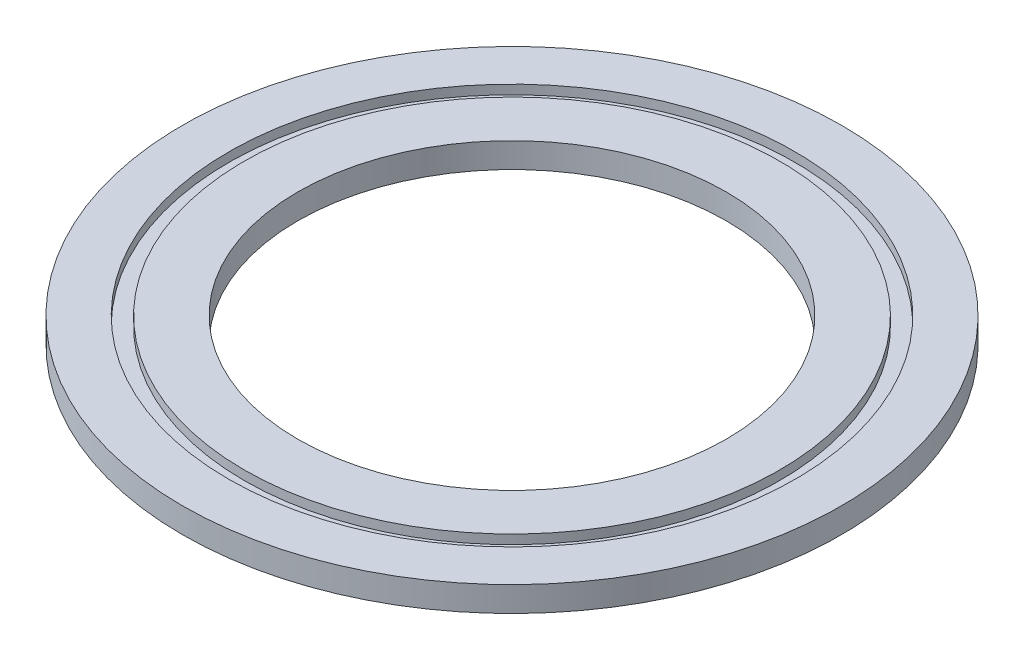
ISO-10303-21;
HEADER;
FILE_DESCRIPTION(('STEP AP214'),'2;1');
FILE_NAME('part.step','',(''),(''),'','','');
FILE_SCHEMA(('AUTOMOTIVE_DESIGN { 1 0 10303 214 1 1 1 1 }'));
ENDSEC;
DATA;
#1=APPLICATION_CONTEXT('core data for automotive mechanical design processes');
#2=APPLICATION_PROTOCOL_DEFINITION('international standard','automotive_design',2000,#1);
#3=PRODUCT_CONTEXT('',#1,'mechanical');
#4=PRODUCT('Part','Part','',(#3));
#5=PRODUCT_RELATED_PRODUCT_CATEGORY('part','',(#4));
#6=PRODUCT_DEFINITION_FORMATION('','',#4);
#7=PRODUCT_DEFINITION_CONTEXT('part definition',#1,'design');
#8=PRODUCT_DEFINITION('design','',#6,#7);
#9=PRODUCT_DEFINITION_SHAPE('','',#8);
#10=(LENGTH_UNIT() NAMED_UNIT(*) SI_UNIT(.MILLI.,.METRE.));
#11=(NAMED_UNIT(*) PLANE_ANGLE_UNIT() SI_UNIT($,.RADIAN.));
#12=(NAMED_UNIT(*) SI_UNIT($,.STERADIAN.) SOLID_ANGLE_UNIT());
#13=UNCERTAINTY_MEASURE_WITH_UNIT(LENGTH_MEASURE(1.E-05),#10,'distance_accuracy_value','');
#14=(GEOMETRIC_REPRESENTATION_CONTEXT(3) GLOBAL_UNCERTAINTY_ASSIGNED_CONTEXT((#13)) GLOBAL_UNIT_ASSIGNED_CONTEXT((#10,
#11,#12)) REPRESENTATION_CONTEXT('',''));
#15=CARTESIAN_POINT('',(0.,0.,0.));
#16=DIRECTION('',(0.,0.,1.));
#17=DIRECTION('',(1.,0.,0.));
#18=AXIS2_PLACEMENT_3D('',#15,#16,#17);
#19=CARTESIAN_POINT('',(0.,19.,0.));
#20=DIRECTION('',(0.,1.,0.));
#21=DIRECTION('',(0.,0.,1.));
#22=AXIS2_PLACEMENT_3D('',#19,#20,#21);
#23=PLANE('',#22);
#24=CARTESIAN_POINT('',(0.,19.,0.));
#25=DIRECTION('',(0.,1.,0.));
#26=DIRECTION('',(0.,0.,1.));
#27=AXIS2_PLACEMENT_3D('',#24,#25,#26);
#28=CIRCLE('',#27,162.5);
#29=CARTESIAN_POINT('',(0.,19.,162.5));
#30=VERTEX_POINT('',#29);
#31=EDGE_CURVE('E47',#30,#30,#28,.T.);
#32=ORIENTED_EDGE('',*,*,#31,.F.);
#33=EDGE_LOOP('',(#32));
#34=FACE_BOUND('',#33,.T.);
#35=CARTESIAN_POINT('',(0.,19.,0.));
#36=DIRECTION('',(0.,1.,0.));
#37=DIRECTION('',(0.,0.,1.));
#38=AXIS2_PLACEMENT_3D('',#35,#36,#37);
#39=CIRCLE('',#38,203.);
#40=CARTESIAN_POINT('',(0.,19.,203.));
#41=VERTEX_POINT('',#40);
#42=EDGE_CURVE('E61',#41,#41,#39,.T.);
#43=ORIENTED_EDGE('',*,*,#42,.T.);
#44=EDGE_LOOP('',(#43));
#45=FACE_BOUND('',#44,.T.);
#46=ADVANCED_FACE('F36',(#34,#45),#23,.T.);
#47=CARTESIAN_POINT('',(0.,19.,0.));
#48=DIRECTION('',(0.,1.,0.));
#49=DIRECTION('',(0.,0.,1.));
#50=AXIS2_PLACEMENT_3D('',#47,#48,#49);
#51=CIRCLE('',#50,215.);
#52=CARTESIAN_POINT('',(0.,19.,215.));
#53=VERTEX_POINT('',#52);
#54=EDGE_CURVE('E55',#53,#53,#51,.T.);
#55=ORIENTED_EDGE('',*,*,#54,.F.);
#56=EDGE_LOOP('',(#55));
#57=FACE_BOUND('',#56,.T.);
#58=CARTESIAN_POINT('',(0.,19.,0.));
#59=DIRECTION('',(0.,1.,0.));
#60=DIRECTION('',(0.,0.,1.));
#61=AXIS2_PLACEMENT_3D('',#58,#59,#60);
#62=CIRCLE('',#61,250.);
#63=CARTESIAN_POINT('',(0.,19.,250.));
#64=VERTEX_POINT('',#63);
#65=EDGE_CURVE('E10',#64,#64,#62,.T.);
#66=ORIENTED_EDGE('',*,*,#65,.T.);
#67=EDGE_LOOP('',(#66));
#68=FACE_BOUND('',#67,.T.);
#69=ADVANCED_FACE('F83',(#57,#68),#23,.T.);
#70=CARTESIAN_POINT('',(0.,0.,0.));
#71=DIRECTION('',(0.,1.,0.));
#72=DIRECTION('',(0.,0.,1.));
#73=AXIS2_PLACEMENT_3D('',#70,#71,#72);
#74=PLANE('',#73);
#75=CARTESIAN_POINT('',(0.,0.,0.));
#76=DIRECTION('',(0.,1.,0.));
#77=DIRECTION('',(0.,0.,1.));
#78=AXIS2_PLACEMENT_3D('',#75,#76,#77);
#79=CIRCLE('',#78,250.);
#80=CARTESIAN_POINT('',(0.,0.,250.));
#81=VERTEX_POINT('',#80);
#82=EDGE_CURVE('E40',#81,#81,#79,.T.);
#83=ORIENTED_EDGE('',*,*,#82,.F.);
#84=EDGE_LOOP('',(#83));
#85=FACE_BOUND('',#84,.T.);
#86=CARTESIAN_POINT('',(0.,0.,0.));
#87=DIRECTION('',(0.,1.,0.));
#88=DIRECTION('',(0.,0.,1.));
#89=AXIS2_PLACEMENT_3D('',#86,#87,#88);
#90=CIRCLE('',#89,162.5);
#91=CARTESIAN_POINT('',(0.,0.,162.5));
#92=VERTEX_POINT('',#91);
#93=EDGE_CURVE('E49',#92,#92,#90,.T.);
#94=ORIENTED_EDGE('',*,*,#93,.T.);
#95=EDGE_LOOP('',(#94));
#96=FACE_BOUND('',#95,.T.);
#97=ADVANCED_FACE('F85',(#85,#96),#74,.F.);
#98=CARTESIAN_POINT('',(0.,19.,0.));
#99=DIRECTION('',(0.,-1.,0.));
#100=DIRECTION('',(0.,0.,-1.));
#101=AXIS2_PLACEMENT_3D('',#98,#99,#100);
#102=CYLINDRICAL_SURFACE('',#101,250.);
#103=ORIENTED_EDGE('',*,*,#65,.F.);
#104=EDGE_LOOP('',(#103));
#105=FACE_BOUND('',#104,.T.);
#106=ORIENTED_EDGE('',*,*,#82,.T.);
#107=EDGE_LOOP('',(#106));
#108=FACE_BOUND('',#107,.T.);
#109=ADVANCED_FACE('F38',(#105,#108),#102,.T.);
#110=CARTESIAN_POINT('',(0.,19.,0.));
#111=DIRECTION('',(0.,-1.,0.));
#112=DIRECTION('',(0.,0.,-1.));
#113=AXIS2_PLACEMENT_3D('',#110,#111,#112);
#114=CYLINDRICAL_SURFACE('',#113,162.5);
#115=ORIENTED_EDGE('',*,*,#31,.T.);
#116=EDGE_LOOP('',(#115));
#117=FACE_BOUND('',#116,.T.);
#118=ORIENTED_EDGE('',*,*,#93,.F.);
#119=EDGE_LOOP('',(#118));
#120=FACE_BOUND('',#119,.T.);
#121=ADVANCED_FACE('F79',(#117,#120),#114,.F.);
#122=CARTESIAN_POINT('',(0.,12.,0.));
#123=DIRECTION('',(0.,1.,0.));
#124=DIRECTION('',(0.,0.,1.));
#125=AXIS2_PLACEMENT_3D('',#122,#123,#124);
#126=CYLINDRICAL_SURFACE('',#125,215.);
#127=CARTESIAN_POINT('',(0.,12.,0.));
#128=DIRECTION('',(0.,1.,0.));
#129=DIRECTION('',(0.,0.,1.));
#130=AXIS2_PLACEMENT_3D('',#127,#128,#129);
#131=CIRCLE('',#130,215.);
#132=CARTESIAN_POINT('',(0.,12.,215.));
#133=VERTEX_POINT('',#132);
#134=EDGE_CURVE('E52',#133,#133,#131,.T.);
#135=ORIENTED_EDGE('',*,*,#134,.F.);
#136=EDGE_LOOP('',(#135));
#137=FACE_BOUND('',#136,.T.);
#138=ORIENTED_EDGE('',*,*,#54,.T.);
#139=EDGE_LOOP('',(#138));
#140=FACE_BOUND('',#139,.T.);
#141=ADVANCED_FACE('F73',(#137,#140),#126,.F.);
#142=CARTESIAN_POINT('',(0.,12.,0.));
#143=DIRECTION('',(0.,1.,0.));
#144=DIRECTION('',(0.,0.,1.));
#145=AXIS2_PLACEMENT_3D('',#142,#143,#144);
#146=PLANE('',#145);
#147=CARTESIAN_POINT('',(0.,12.,0.));
#148=DIRECTION('',(0.,1.,0.));
#149=DIRECTION('',(0.,0.,1.));
#150=AXIS2_PLACEMENT_3D('',#147,#148,#149);
#151=CIRCLE('',#150,203.);
#152=CARTESIAN_POINT('',(0.,12.,203.));
#153=VERTEX_POINT('',#152);
#154=EDGE_CURVE('E58',#153,#153,#151,.T.);
#155=ORIENTED_EDGE('',*,*,#154,.F.);
#156=EDGE_LOOP('',(#155));
#157=FACE_BOUND('',#156,.T.);
#158=ORIENTED_EDGE('',*,*,#134,.T.);
#159=EDGE_LOOP('',(#158));
#160=FACE_BOUND('',#159,.T.);
#161=ADVANCED_FACE('F70',(#157,#160),#146,.T.);
#162=CARTESIAN_POINT('',(0.,12.,0.));
#163=DIRECTION('',(0.,1.,0.));
#164=DIRECTION('',(0.,0.,1.));
#165=AXIS2_PLACEMENT_3D('',#162,#163,#164);
#166=CYLINDRICAL_SURFACE('',#165,203.);
#167=ORIENTED_EDGE('',*,*,#154,.T.);
#168=EDGE_LOOP('',(#167));
#169=FACE_BOUND('',#168,.T.);
#170=ORIENTED_EDGE('',*,*,#42,.F.);
#171=EDGE_LOOP('',(#170));
#172=FACE_BOUND('',#171,.T.);
#173=ADVANCED_FACE('F67',(#169,#172),#166,.T.);
#174=CLOSED_SHELL('',(#46,#69,#97,#109,#121,#141,#161,#173));
#175=MANIFOLD_SOLID_BREP('B2',#174);
#176=ADVANCED_BREP_SHAPE_REPRESENTATION('',(#18,#175),#14);
#177=SHAPE_DEFINITION_REPRESENTATION(#9,#176);
ENDSEC;
END-ISO-10303-21;
